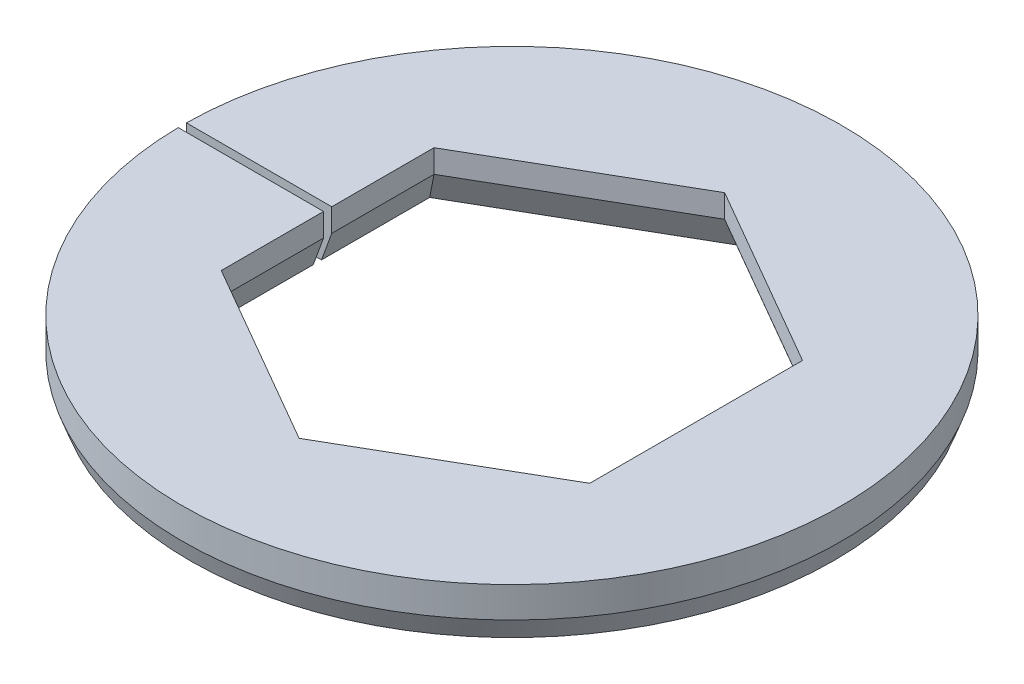
ISO-10303-21;
HEADER;
FILE_DESCRIPTION(('STEP AP214'),'2;1');
FILE_NAME('part.step','',(''),(''),'','','');
FILE_SCHEMA(('AUTOMOTIVE_DESIGN { 1 0 10303 214 1 1 1 1 }'));
ENDSEC;
DATA;
#1=APPLICATION_CONTEXT('core data for automotive mechanical design processes');
#2=APPLICATION_PROTOCOL_DEFINITION('international standard','automotive_design',2000,#1);
#3=PRODUCT_CONTEXT('',#1,'mechanical');
#4=PRODUCT('Part','Part','',(#3));
#5=PRODUCT_RELATED_PRODUCT_CATEGORY('part','',(#4));
#6=PRODUCT_DEFINITION_FORMATION('','',#4);
#7=PRODUCT_DEFINITION_CONTEXT('part definition',#1,'design');
#8=PRODUCT_DEFINITION('design','',#6,#7);
#9=PRODUCT_DEFINITION_SHAPE('','',#8);
#10=(LENGTH_UNIT() NAMED_UNIT(*) SI_UNIT(.MILLI.,.METRE.));
#11=(NAMED_UNIT(*) PLANE_ANGLE_UNIT() SI_UNIT($,.RADIAN.));
#12=(NAMED_UNIT(*) SI_UNIT($,.STERADIAN.) SOLID_ANGLE_UNIT());
#13=UNCERTAINTY_MEASURE_WITH_UNIT(LENGTH_MEASURE(1.E-05),#10,'distance_accuracy_value','');
#14=(GEOMETRIC_REPRESENTATION_CONTEXT(3) GLOBAL_UNCERTAINTY_ASSIGNED_CONTEXT((#13)) GLOBAL_UNIT_ASSIGNED_CONTEXT((#10,
#11,#12)) REPRESENTATION_CONTEXT('',''));
#15=CARTESIAN_POINT('',(0.,0.,0.));
#16=DIRECTION('',(0.,0.,1.));
#17=DIRECTION('',(1.,0.,0.));
#18=AXIS2_PLACEMENT_3D('',#15,#16,#17);
#19=CARTESIAN_POINT('',(-9.,0.,-5.19615242270663));
#20=DIRECTION('',(-1.,0.,0.));
#21=DIRECTION('',(0.,0.,1.));
#22=AXIS2_PLACEMENT_3D('',#19,#20,#21);
#23=PLANE('',#22);
#24=DIRECTION('',(0.,1.,0.));
#25=VECTOR('',#24,1.);
#26=CARTESIAN_POINT('',(-9.,0.,5.19615242270663));
#27=LINE('',#26,#25);
#28=CARTESIAN_POINT('',(-9.,1.3737387097273,5.19615242270663));
#29=VERTEX_POINT('',#28);
#30=CARTESIAN_POINT('',(-9.,2.5,5.19615242270663));
#31=VERTEX_POINT('',#30);
#32=EDGE_CURVE('E197',#29,#31,#27,.T.);
#33=ORIENTED_EDGE('',*,*,#32,.F.);
#34=DIRECTION('',(0.,0.,-1.));
#35=VECTOR('',#34,1.);
#36=CARTESIAN_POINT('',(-9.,1.3737387097273,-5.19615242270663));
#37=LINE('',#36,#35);
#38=CARTESIAN_POINT('',(-9.,1.3737387097273,0.2));
#39=VERTEX_POINT('',#38);
#40=EDGE_CURVE('E288',#29,#39,#37,.T.);
#41=ORIENTED_EDGE('',*,*,#40,.T.);
#42=DIRECTION('',(0.,1.,0.));
#43=VECTOR('',#42,1.);
#44=CARTESIAN_POINT('',(-9.,0.,0.2));
#45=LINE('',#44,#43);
#46=CARTESIAN_POINT('',(-9.,2.5,0.200000000000001));
#47=VERTEX_POINT('',#46);
#48=EDGE_CURVE('E157',#39,#47,#45,.T.);
#49=ORIENTED_EDGE('',*,*,#48,.T.);
#50=DIRECTION('',(0.,0.,1.));
#51=VECTOR('',#50,1.);
#52=CARTESIAN_POINT('',(-9.,2.5,-5.19615242270663));
#53=LINE('',#52,#51);
#54=EDGE_CURVE('E175',#47,#31,#53,.T.);
#55=ORIENTED_EDGE('',*,*,#54,.T.);
#56=EDGE_LOOP('',(#33,#41,#49,#55));
#57=FACE_BOUND('',#56,.T.);
#58=ADVANCED_FACE('F36',(#57),#23,.F.);
#59=CARTESIAN_POINT('',(0.,2.5,0.));
#60=DIRECTION('',(0.,-1.,0.));
#61=DIRECTION('',(0.,0.,-1.));
#62=AXIS2_PLACEMENT_3D('',#59,#60,#61);
#63=CYLINDRICAL_SURFACE('',#62,16.1);
#64=DIRECTION('',(0.,-1.,0.));
#65=VECTOR('',#64,1.);
#66=CARTESIAN_POINT('',(-16.0987577160475,2.5,0.199999999999999));
#67=LINE('',#66,#65);
#68=CARTESIAN_POINT('',(-16.0987577160475,2.5,0.199999999999999));
#69=VERTEX_POINT('',#68);
#70=CARTESIAN_POINT('',(-16.0987577160475,1.00000000000004,0.199999999999999));
#71=VERTEX_POINT('',#70);
#72=EDGE_CURVE('E260',#69,#71,#67,.T.);
#73=ORIENTED_EDGE('',*,*,#72,.T.);
#74=CARTESIAN_POINT('',(0.,1.00000000000004,0.));
#75=DIRECTION('',(0.,1.,0.));
#76=DIRECTION('',(0.,0.,1.));
#77=AXIS2_PLACEMENT_3D('',#74,#75,#76);
#78=CIRCLE('',#77,16.1);
#79=CARTESIAN_POINT('',(-16.0987577160475,1.00000000000004,-0.199999999999999));
#80=VERTEX_POINT('',#79);
#81=EDGE_CURVE('E202',#71,#80,#78,.T.);
#82=ORIENTED_EDGE('',*,*,#81,.T.);
#83=DIRECTION('',(0.,-1.,0.));
#84=VECTOR('',#83,1.);
#85=CARTESIAN_POINT('',(-16.0987577160475,2.5,-0.199999999999999));
#86=LINE('',#85,#84);
#87=CARTESIAN_POINT('',(-16.0987577160475,2.5,-0.199999999999999));
#88=VERTEX_POINT('',#87);
#89=EDGE_CURVE('E265',#80,#88,#86,.F.);
#90=ORIENTED_EDGE('',*,*,#89,.T.);
#91=CARTESIAN_POINT('',(0.,2.5,0.));
#92=DIRECTION('',(0.,1.,0.));
#93=DIRECTION('',(0.,0.,1.));
#94=AXIS2_PLACEMENT_3D('',#91,#92,#93);
#95=CIRCLE('',#94,16.1);
#96=EDGE_CURVE('E167',#69,#88,#95,.T.);
#97=ORIENTED_EDGE('',*,*,#96,.F.);
#98=EDGE_LOOP('',(#73,#82,#90,#97));
#99=FACE_BOUND('',#98,.T.);
#100=ADVANCED_FACE('F250',(#99),#63,.T.);
#101=CARTESIAN_POINT('',(0.,2.5,0.));
#102=DIRECTION('',(0.,1.,0.));
#103=DIRECTION('',(0.,0.,1.));
#104=AXIS2_PLACEMENT_3D('',#101,#102,#103);
#105=PLANE('',#104);
#106=DIRECTION('',(1.,0.,0.));
#107=VECTOR('',#106,1.);
#108=CARTESIAN_POINT('',(-9.,2.5,0.2));
#109=LINE('',#108,#107);
#110=EDGE_CURVE('E168',#69,#47,#109,.T.);
#111=ORIENTED_EDGE('',*,*,#110,.F.);
#112=ORIENTED_EDGE('',*,*,#96,.T.);
#113=DIRECTION('',(-1.,0.,0.));
#114=VECTOR('',#113,1.);
#115=CARTESIAN_POINT('',(-9.,2.5,-0.2));
#116=LINE('',#115,#114);
#117=CARTESIAN_POINT('',(-9.,2.5,-0.2));
#118=VERTEX_POINT('',#117);
#119=EDGE_CURVE('E150',#118,#88,#116,.T.);
#120=ORIENTED_EDGE('',*,*,#119,.F.);
#121=CARTESIAN_POINT('',(-9.,2.5,-5.19615242270663));
#122=VERTEX_POINT('',#121);
#123=EDGE_CURVE('E165',#122,#118,#53,.T.);
#124=ORIENTED_EDGE('',*,*,#123,.F.);
#125=DIRECTION('',(-0.866025403784439,0.,0.5));
#126=VECTOR('',#125,1.);
#127=CARTESIAN_POINT('',(0.,2.5,-10.3923048454133));
#128=LINE('',#127,#126);
#129=CARTESIAN_POINT('',(0.,2.5,-10.3923048454133));
#130=VERTEX_POINT('',#129);
#131=EDGE_CURVE('E181',#130,#122,#128,.T.);
#132=ORIENTED_EDGE('',*,*,#131,.F.);
#133=DIRECTION('',(-0.866025403784438,0.,-0.5));
#134=VECTOR('',#133,1.);
#135=CARTESIAN_POINT('',(9.,2.5,-5.19615242270664));
#136=LINE('',#135,#134);
#137=CARTESIAN_POINT('',(9.,2.5,-5.19615242270664));
#138=VERTEX_POINT('',#137);
#139=EDGE_CURVE('E264',#138,#130,#136,.T.);
#140=ORIENTED_EDGE('',*,*,#139,.F.);
#141=DIRECTION('',(0.,0.,-1.));
#142=VECTOR('',#141,1.);
#143=CARTESIAN_POINT('',(9.,2.5,5.19615242270664));
#144=LINE('',#143,#142);
#145=CARTESIAN_POINT('',(9.,2.5,5.19615242270664));
#146=VERTEX_POINT('',#145);
#147=EDGE_CURVE('E187',#146,#138,#144,.T.);
#148=ORIENTED_EDGE('',*,*,#147,.F.);
#149=DIRECTION('',(0.866025403784439,0.,-0.5));
#150=VECTOR('',#149,1.);
#151=CARTESIAN_POINT('',(0.,2.5,10.3923048454133));
#152=LINE('',#151,#150);
#153=CARTESIAN_POINT('',(0.,2.5,10.3923048454133));
#154=VERTEX_POINT('',#153);
#155=EDGE_CURVE('E178',#154,#146,#152,.T.);
#156=ORIENTED_EDGE('',*,*,#155,.F.);
#157=DIRECTION('',(0.866025403784439,0.,0.5));
#158=VECTOR('',#157,1.);
#159=CARTESIAN_POINT('',(-9.,2.5,5.19615242270663));
#160=LINE('',#159,#158);
#161=EDGE_CURVE('E174',#31,#154,#160,.T.);
#162=ORIENTED_EDGE('',*,*,#161,.F.);
#163=ORIENTED_EDGE('',*,*,#54,.F.);
#164=EDGE_LOOP('',(#111,#112,#120,#124,#132,#140,#148,#156,#162,#163));
#165=FACE_BOUND('',#164,.T.);
#166=ADVANCED_FACE('F163',(#165),#105,.T.);
#167=CARTESIAN_POINT('',(0.,0.,0.));
#168=DIRECTION('',(0.,1.,0.));
#169=DIRECTION('',(0.,0.,1.));
#170=AXIS2_PLACEMENT_3D('',#167,#168,#169);
#171=PLANE('',#170);
#172=DIRECTION('',(1.,0.,0.));
#173=VECTOR('',#172,1.);
#174=CARTESIAN_POINT('',(-9.,0.,0.2));
#175=LINE('',#174,#173);
#176=CARTESIAN_POINT('',(-15.7347587457851,0.,0.199999999999999));
#177=VERTEX_POINT('',#176);
#178=CARTESIAN_POINT('',(-9.5,0.,0.2));
#179=VERTEX_POINT('',#178);
#180=EDGE_CURVE('E158',#177,#179,#175,.T.);
#181=ORIENTED_EDGE('',*,*,#180,.T.);
#182=DIRECTION('',(0.,0.,1.));
#183=VECTOR('',#182,1.);
#184=CARTESIAN_POINT('',(-9.5,0.,0.));
#185=LINE('',#184,#183);
#186=CARTESIAN_POINT('',(-9.5,0.,5.48482755730144));
#187=VERTEX_POINT('',#186);
#188=EDGE_CURVE('E297',#179,#187,#185,.T.);
#189=ORIENTED_EDGE('',*,*,#188,.T.);
#190=DIRECTION('',(0.866025403784439,0.,0.5));
#191=VECTOR('',#190,1.);
#192=CARTESIAN_POINT('',(-4.75,0.,8.22724133595217));
#193=LINE('',#192,#191);
#194=CARTESIAN_POINT('',(0.,0.,10.9696551146029));
#195=VERTEX_POINT('',#194);
#196=EDGE_CURVE('E350',#187,#195,#193,.T.);
#197=ORIENTED_EDGE('',*,*,#196,.T.);
#198=DIRECTION('',(0.866025403784439,0.,-0.5));
#199=VECTOR('',#198,1.);
#200=CARTESIAN_POINT('',(4.75,0.,8.22724133595217));
#201=LINE('',#200,#199);
#202=CARTESIAN_POINT('',(9.49999999999999,0.,5.48482755730145));
#203=VERTEX_POINT('',#202);
#204=EDGE_CURVE('E348',#195,#203,#201,.T.);
#205=ORIENTED_EDGE('',*,*,#204,.T.);
#206=DIRECTION('',(0.,0.,-1.));
#207=VECTOR('',#206,1.);
#208=CARTESIAN_POINT('',(9.49999999999999,0.,0.));
#209=LINE('',#208,#207);
#210=CARTESIAN_POINT('',(9.49999999999999,0.,-5.48482755730145));
#211=VERTEX_POINT('',#210);
#212=EDGE_CURVE('E344',#203,#211,#209,.T.);
#213=ORIENTED_EDGE('',*,*,#212,.T.);
#214=DIRECTION('',(-0.866025403784439,0.,-0.5));
#215=VECTOR('',#214,1.);
#216=CARTESIAN_POINT('',(4.75,0.,-8.22724133595217));
#217=LINE('',#216,#215);
#218=CARTESIAN_POINT('',(0.,0.,-10.9696551146029));
#219=VERTEX_POINT('',#218);
#220=EDGE_CURVE('E343',#211,#219,#217,.T.);
#221=ORIENTED_EDGE('',*,*,#220,.T.);
#222=DIRECTION('',(-0.866025403784439,0.,0.5));
#223=VECTOR('',#222,1.);
#224=CARTESIAN_POINT('',(-4.75,0.,-8.22724133595217));
#225=LINE('',#224,#223);
#226=CARTESIAN_POINT('',(-9.5,0.,-5.48482755730145));
#227=VERTEX_POINT('',#226);
#228=EDGE_CURVE('E307',#219,#227,#225,.T.);
#229=ORIENTED_EDGE('',*,*,#228,.T.);
#230=DIRECTION('',(0.,0.,1.));
#231=VECTOR('',#230,1.);
#232=CARTESIAN_POINT('',(-9.5,0.,0.));
#233=LINE('',#232,#231);
#234=CARTESIAN_POINT('',(-9.5,0.,-0.2));
#235=VERTEX_POINT('',#234);
#236=EDGE_CURVE('E304',#227,#235,#233,.T.);
#237=ORIENTED_EDGE('',*,*,#236,.T.);
#238=DIRECTION('',(-1.,0.,0.));
#239=VECTOR('',#238,1.);
#240=CARTESIAN_POINT('',(-9.,0.,-0.2));
#241=LINE('',#240,#239);
#242=CARTESIAN_POINT('',(-15.7347587457851,0.,-0.199999999999999));
#243=VERTEX_POINT('',#242);
#244=EDGE_CURVE('E271',#235,#243,#241,.T.);
#245=ORIENTED_EDGE('',*,*,#244,.T.);
#246=CARTESIAN_POINT('',(0.,0.,0.));
#247=DIRECTION('',(0.,1.,0.));
#248=DIRECTION('',(0.,0.,1.));
#249=AXIS2_PLACEMENT_3D('',#246,#247,#248);
#250=CIRCLE('',#249,15.7360297657338);
#251=EDGE_CURVE('E214',#243,#177,#250,.F.);
#252=ORIENTED_EDGE('',*,*,#251,.T.);
#253=EDGE_LOOP('',(#181,#189,#197,#205,#213,#221,#229,#237,#245,#252));
#254=FACE_BOUND('',#253,.T.);
#255=ADVANCED_FACE('F246',(#254),#171,.F.);
#256=CARTESIAN_POINT('',(9.,0.,-5.19615242270664));
#257=DIRECTION('',(0.5,0.,-0.866025403784439));
#258=DIRECTION('',(-0.866025403784439,0.,-0.5));
#259=AXIS2_PLACEMENT_3D('',#256,#257,#258);
#260=PLANE('',#259);
#261=DIRECTION('',(0.,1.,0.));
#262=VECTOR('',#261,1.);
#263=CARTESIAN_POINT('',(0.,0.,-10.3923048454133));
#264=LINE('',#263,#262);
#265=CARTESIAN_POINT('',(0.,1.3737387097273,-10.3923048454133));
#266=VERTEX_POINT('',#265);
#267=EDGE_CURVE('E190',#266,#130,#264,.T.);
#268=ORIENTED_EDGE('',*,*,#267,.F.);
#269=DIRECTION('',(0.866025403784439,0.,0.5));
#270=VECTOR('',#269,1.);
#271=CARTESIAN_POINT('',(9.,1.3737387097273,-5.19615242270664));
#272=LINE('',#271,#270);
#273=CARTESIAN_POINT('',(9.,1.3737387097273,-5.19615242270664));
#274=VERTEX_POINT('',#273);
#275=EDGE_CURVE('E317',#266,#274,#272,.T.);
#276=ORIENTED_EDGE('',*,*,#275,.T.);
#277=DIRECTION('',(0.,1.,0.));
#278=VECTOR('',#277,1.);
#279=CARTESIAN_POINT('',(9.,0.,-5.19615242270664));
#280=LINE('',#279,#278);
#281=EDGE_CURVE('E191',#274,#138,#280,.T.);
#282=ORIENTED_EDGE('',*,*,#281,.T.);
#283=ORIENTED_EDGE('',*,*,#139,.T.);
#284=EDGE_LOOP('',(#268,#276,#282,#283));
#285=FACE_BOUND('',#284,.T.);
#286=ADVANCED_FACE('F232',(#285),#260,.F.);
#287=CARTESIAN_POINT('',(9.,0.,5.19615242270664));
#288=DIRECTION('',(1.,0.,0.));
#289=DIRECTION('',(0.,0.,-1.));
#290=AXIS2_PLACEMENT_3D('',#287,#288,#289);
#291=PLANE('',#290);
#292=ORIENTED_EDGE('',*,*,#281,.F.);
#293=DIRECTION('',(0.,0.,1.));
#294=VECTOR('',#293,1.);
#295=CARTESIAN_POINT('',(9.,1.3737387097273,5.19615242270664));
#296=LINE('',#295,#294);
#297=CARTESIAN_POINT('',(9.,1.3737387097273,5.19615242270664));
#298=VERTEX_POINT('',#297);
#299=EDGE_CURVE('E61',#274,#298,#296,.T.);
#300=ORIENTED_EDGE('',*,*,#299,.T.);
#301=DIRECTION('',(0.,1.,0.));
#302=VECTOR('',#301,1.);
#303=CARTESIAN_POINT('',(9.,0.,5.19615242270664));
#304=LINE('',#303,#302);
#305=EDGE_CURVE('E193',#298,#146,#304,.T.);
#306=ORIENTED_EDGE('',*,*,#305,.T.);
#307=ORIENTED_EDGE('',*,*,#147,.T.);
#308=EDGE_LOOP('',(#292,#300,#306,#307));
#309=FACE_BOUND('',#308,.T.);
#310=ADVANCED_FACE('F228',(#309),#291,.F.);
#311=CARTESIAN_POINT('',(0.,0.,10.3923048454133));
#312=DIRECTION('',(0.5,0.,0.866025403784439));
#313=DIRECTION('',(0.866025403784439,0.,-0.5));
#314=AXIS2_PLACEMENT_3D('',#311,#312,#313);
#315=PLANE('',#314);
#316=ORIENTED_EDGE('',*,*,#305,.F.);
#317=DIRECTION('',(-0.866025403784439,0.,0.5));
#318=VECTOR('',#317,1.);
#319=CARTESIAN_POINT('',(0.,1.3737387097273,10.3923048454133));
#320=LINE('',#319,#318);
#321=CARTESIAN_POINT('',(0.,1.3737387097273,10.3923048454133));
#322=VERTEX_POINT('',#321);
#323=EDGE_CURVE('E46',#298,#322,#320,.T.);
#324=ORIENTED_EDGE('',*,*,#323,.T.);
#325=DIRECTION('',(0.,1.,0.));
#326=VECTOR('',#325,1.);
#327=CARTESIAN_POINT('',(0.,0.,10.3923048454133));
#328=LINE('',#327,#326);
#329=EDGE_CURVE('E195',#322,#154,#328,.T.);
#330=ORIENTED_EDGE('',*,*,#329,.T.);
#331=ORIENTED_EDGE('',*,*,#155,.T.);
#332=EDGE_LOOP('',(#316,#324,#330,#331));
#333=FACE_BOUND('',#332,.T.);
#334=ADVANCED_FACE('F231',(#333),#315,.F.);
#335=CARTESIAN_POINT('',(-9.,0.,5.19615242270663));
#336=DIRECTION('',(-0.5,0.,0.866025403784439));
#337=DIRECTION('',(0.866025403784439,0.,0.5));
#338=AXIS2_PLACEMENT_3D('',#335,#336,#337);
#339=PLANE('',#338);
#340=ORIENTED_EDGE('',*,*,#329,.F.);
#341=DIRECTION('',(-0.866025403784439,0.,-0.5));
#342=VECTOR('',#341,1.);
#343=CARTESIAN_POINT('',(-9.,1.3737387097273,5.19615242270663));
#344=LINE('',#343,#342);
#345=EDGE_CURVE('E11',#322,#29,#344,.T.);
#346=ORIENTED_EDGE('',*,*,#345,.T.);
#347=ORIENTED_EDGE('',*,*,#32,.T.);
#348=ORIENTED_EDGE('',*,*,#161,.T.);
#349=EDGE_LOOP('',(#340,#346,#347,#348));
#350=FACE_BOUND('',#349,.T.);
#351=ADVANCED_FACE('F235',(#350),#339,.F.);
#352=DIRECTION('',(0.,1.,0.));
#353=VECTOR('',#352,1.);
#354=CARTESIAN_POINT('',(-9.,0.,-0.2));
#355=LINE('',#354,#353);
#356=CARTESIAN_POINT('',(-9.,1.3737387097273,-0.2));
#357=VERTEX_POINT('',#356);
#358=EDGE_CURVE('E145',#357,#118,#355,.T.);
#359=ORIENTED_EDGE('',*,*,#358,.F.);
#360=DIRECTION('',(0.,0.,-1.));
#361=VECTOR('',#360,1.);
#362=CARTESIAN_POINT('',(-9.,1.3737387097273,-5.19615242270663));
#363=LINE('',#362,#361);
#364=CARTESIAN_POINT('',(-9.,1.3737387097273,-5.19615242270663));
#365=VERTEX_POINT('',#364);
#366=EDGE_CURVE('E313',#357,#365,#363,.T.);
#367=ORIENTED_EDGE('',*,*,#366,.T.);
#368=DIRECTION('',(0.,1.,0.));
#369=VECTOR('',#368,1.);
#370=CARTESIAN_POINT('',(-9.,0.,-5.19615242270663));
#371=LINE('',#370,#369);
#372=EDGE_CURVE('E172',#365,#122,#371,.T.);
#373=ORIENTED_EDGE('',*,*,#372,.T.);
#374=ORIENTED_EDGE('',*,*,#123,.T.);
#375=EDGE_LOOP('',(#359,#367,#373,#374));
#376=FACE_BOUND('',#375,.T.);
#377=ADVANCED_FACE('F170',(#376),#23,.F.);
#378=CARTESIAN_POINT('',(0.,0.,-10.3923048454133));
#379=DIRECTION('',(-0.5,0.,-0.866025403784439));
#380=DIRECTION('',(-0.866025403784439,0.,0.5));
#381=AXIS2_PLACEMENT_3D('',#378,#379,#380);
#382=PLANE('',#381);
#383=ORIENTED_EDGE('',*,*,#372,.F.);
#384=DIRECTION('',(0.866025403784439,0.,-0.5));
#385=VECTOR('',#384,1.);
#386=CARTESIAN_POINT('',(0.,1.3737387097273,-10.3923048454133));
#387=LINE('',#386,#385);
#388=EDGE_CURVE('E315',#365,#266,#387,.T.);
#389=ORIENTED_EDGE('',*,*,#388,.T.);
#390=ORIENTED_EDGE('',*,*,#267,.T.);
#391=ORIENTED_EDGE('',*,*,#131,.T.);
#392=EDGE_LOOP('',(#383,#389,#390,#391));
#393=FACE_BOUND('',#392,.T.);
#394=ADVANCED_FACE('F226',(#393),#382,.F.);
#395=CARTESIAN_POINT('',(-9.,0.,-0.2));
#396=DIRECTION('',(0.,0.,-1.));
#397=DIRECTION('',(-1.,0.,0.));
#398=AXIS2_PLACEMENT_3D('',#395,#396,#397);
#399=PLANE('',#398);
#400=ORIENTED_EDGE('',*,*,#244,.F.);
#401=DIRECTION('',(-0.34202014332567,-0.939692620785908,0.));
#402=VECTOR('',#401,1.);
#403=CARTESIAN_POINT('',(-9.5,0.,-0.2));
#404=LINE('',#403,#402);
#405=EDGE_CURVE('E153',#235,#357,#404,.F.);
#406=ORIENTED_EDGE('',*,*,#405,.T.);
#407=ORIENTED_EDGE('',*,*,#358,.T.);
#408=ORIENTED_EDGE('',*,*,#119,.T.);
#409=ORIENTED_EDGE('',*,*,#89,.F.);
#410=CARTESIAN_POINT('',(-16.0987577160475,1.00000000000004,-0.199999999999999));
#411=CARTESIAN_POINT('',(-16.0380913177128,0.833333298131377,-0.199999999999999));
#412=CARTESIAN_POINT('',(-15.9774248710236,0.666666613863712,-0.199999999999999));
#413=CARTESIAN_POINT('',(-15.8560918809361,0.333333280530367,-0.199999999999999));
#414=CARTESIAN_POINT('',(-15.7954253375378,0.166666631464687,-0.199999999999999));
#415=CARTESIAN_POINT('',(-15.7347587457851,0.,-0.199999999999999));
#416=B_SPLINE_CURVE_WITH_KNOTS('',3,(#410,#411,#412,#413,#414,#415),.UNSPECIFIED.,.F.,.F.,(4,2,
4),(0.,0.532093800554069,1.06418760110814),.UNSPECIFIED.);
#417=EDGE_CURVE('E205',#80,#243,#416,.T.);
#418=ORIENTED_EDGE('',*,*,#417,.T.);
#419=EDGE_LOOP('',(#400,#406,#407,#408,#409,#418));
#420=FACE_BOUND('',#419,.T.);
#421=ADVANCED_FACE('F148',(#420),#399,.F.);
#422=CARTESIAN_POINT('',(-9.,0.,0.2));
#423=DIRECTION('',(0.,0.,1.));
#424=DIRECTION('',(1.,0.,0.));
#425=AXIS2_PLACEMENT_3D('',#422,#423,#424);
#426=PLANE('',#425);
#427=ORIENTED_EDGE('',*,*,#48,.F.);
#428=DIRECTION('',(0.34202014332567,0.939692620785908,0.));
#429=VECTOR('',#428,1.);
#430=CARTESIAN_POINT('',(-9.5,0.,0.2));
#431=LINE('',#430,#429);
#432=EDGE_CURVE('E300',#39,#179,#431,.F.);
#433=ORIENTED_EDGE('',*,*,#432,.T.);
#434=ORIENTED_EDGE('',*,*,#180,.F.);
#435=CARTESIAN_POINT('',(-15.7347587457851,0.,0.199999999999999));
#436=CARTESIAN_POINT('',(-15.7954253375378,0.166666631464687,0.199999999999999));
#437=CARTESIAN_POINT('',(-15.8560918809361,0.333333280530367,0.199999999999999));
#438=CARTESIAN_POINT('',(-15.9774248710236,0.666666613863712,0.199999999999999));
#439=CARTESIAN_POINT('',(-16.0380913177128,0.833333298131377,0.199999999999999));
#440=CARTESIAN_POINT('',(-16.0987577160475,1.00000000000004,0.199999999999999));
#441=B_SPLINE_CURVE_WITH_KNOTS('',3,(#435,#436,#437,#438,#439,#440),.UNSPECIFIED.,.F.,.F.,(4,2,
4),(0.,0.532093800554071,1.06418760110814),.UNSPECIFIED.);
#442=EDGE_CURVE('E270',#177,#71,#441,.T.);
#443=ORIENTED_EDGE('',*,*,#442,.T.);
#444=ORIENTED_EDGE('',*,*,#72,.F.);
#445=ORIENTED_EDGE('',*,*,#110,.T.);
#446=EDGE_LOOP('',(#427,#433,#434,#443,#444,#445));
#447=FACE_BOUND('',#446,.T.);
#448=ADVANCED_FACE('F225',(#447),#426,.F.);
#449=CARTESIAN_POINT('',(0.,1.00000000000004,0.));
#450=DIRECTION('',(0.,1.,0.));
#451=DIRECTION('',(0.,0.,1.));
#452=AXIS2_PLACEMENT_3D('',#449,#450,#451);
#453=CONICAL_SURFACE('',#452,16.1,0.349065850398863);
#454=ORIENTED_EDGE('',*,*,#442,.F.);
#455=ORIENTED_EDGE('',*,*,#251,.F.);
#456=ORIENTED_EDGE('',*,*,#417,.F.);
#457=ORIENTED_EDGE('',*,*,#81,.F.);
#458=EDGE_LOOP('',(#454,#455,#456,#457));
#459=FACE_BOUND('',#458,.T.);
#460=ADVANCED_FACE('F217',(#459),#453,.T.);
#461=CARTESIAN_POINT('',(-9.5,0.,0.));
#462=DIRECTION('',(-0.939692620785908,0.34202014332567,0.));
#463=DIRECTION('',(0.,0.,1.));
#464=AXIS2_PLACEMENT_3D('',#461,#462,#463);
#465=PLANE('',#464);
#466=ORIENTED_EDGE('',*,*,#405,.F.);
#467=ORIENTED_EDGE('',*,*,#236,.F.);
#468=DIRECTION('',(-0.335540895264848,-0.921891033043757,-0.193724626205287));
#469=VECTOR('',#468,1.);
#470=CARTESIAN_POINT('',(-9.1434723074154,0.979551784786433,-5.27898619801417));
#471=LINE('',#470,#469);
#472=EDGE_CURVE('E41',#365,#227,#471,.T.);
#473=ORIENTED_EDGE('',*,*,#472,.F.);
#474=ORIENTED_EDGE('',*,*,#366,.F.);
#475=EDGE_LOOP('',(#466,#467,#473,#474));
#476=FACE_BOUND('',#475,.T.);
#477=ADVANCED_FACE('F39',(#476),#465,.F.);
#478=CARTESIAN_POINT('',(-4.75,0.,-8.22724133595217));
#479=DIRECTION('',(-0.469846310392954,0.342020143325669,-0.813797681349374));
#480=DIRECTION('',(-0.866025403784439,0.,0.5));
#481=AXIS2_PLACEMENT_3D('',#478,#479,#480);
#482=PLANE('',#481);
#483=ORIENTED_EDGE('',*,*,#472,.T.);
#484=ORIENTED_EDGE('',*,*,#228,.F.);
#485=DIRECTION('',(0.,-0.921891033043757,-0.387449252410575));
#486=VECTOR('',#485,1.);
#487=CARTESIAN_POINT('',(0.,0.979551784786433,-10.5579723960283));
#488=LINE('',#487,#486);
#489=EDGE_CURVE('E330',#266,#219,#488,.T.);
#490=ORIENTED_EDGE('',*,*,#489,.F.);
#491=ORIENTED_EDGE('',*,*,#388,.F.);
#492=EDGE_LOOP('',(#483,#484,#490,#491));
#493=FACE_BOUND('',#492,.T.);
#494=ADVANCED_FACE('F340',(#493),#482,.F.);
#495=CARTESIAN_POINT('',(4.75,0.,-8.22724133595217));
#496=DIRECTION('',(0.469846310392954,0.342020143325668,-0.813797681349374));
#497=DIRECTION('',(-0.866025403784439,0.,-0.5));
#498=AXIS2_PLACEMENT_3D('',#495,#496,#497);
#499=PLANE('',#498);
#500=ORIENTED_EDGE('',*,*,#489,.T.);
#501=ORIENTED_EDGE('',*,*,#220,.F.);
#502=DIRECTION('',(0.335540895264849,-0.921891033043757,-0.193724626205287));
#503=VECTOR('',#502,1.);
#504=CARTESIAN_POINT('',(9.1434723074154,0.97955178478644,-5.27898619801417));
#505=LINE('',#504,#503);
#506=EDGE_CURVE('E328',#274,#211,#505,.T.);
#507=ORIENTED_EDGE('',*,*,#506,.F.);
#508=ORIENTED_EDGE('',*,*,#275,.F.);
#509=EDGE_LOOP('',(#500,#501,#507,#508));
#510=FACE_BOUND('',#509,.T.);
#511=ADVANCED_FACE('F384',(#510),#499,.F.);
#512=CARTESIAN_POINT('',(9.49999999999999,0.,0.));
#513=DIRECTION('',(0.939692620785908,0.34202014332567,0.));
#514=DIRECTION('',(0.,0.,-1.));
#515=AXIS2_PLACEMENT_3D('',#512,#513,#514);
#516=PLANE('',#515);
#517=ORIENTED_EDGE('',*,*,#506,.T.);
#518=ORIENTED_EDGE('',*,*,#212,.F.);
#519=DIRECTION('',(0.335540895264849,-0.921891033043757,0.193724626205287));
#520=VECTOR('',#519,1.);
#521=CARTESIAN_POINT('',(9.1434723074154,0.979551784786432,5.27898619801418));
#522=LINE('',#521,#520);
#523=EDGE_CURVE('E325',#298,#203,#522,.T.);
#524=ORIENTED_EDGE('',*,*,#523,.F.);
#525=ORIENTED_EDGE('',*,*,#299,.F.);
#526=EDGE_LOOP('',(#517,#518,#524,#525));
#527=FACE_BOUND('',#526,.T.);
#528=ADVANCED_FACE('F368',(#527),#516,.F.);
#529=CARTESIAN_POINT('',(4.75,0.,8.22724133595217));
#530=DIRECTION('',(0.469846310392954,0.342020143325669,0.813797681349374));
#531=DIRECTION('',(0.866025403784439,0.,-0.5));
#532=AXIS2_PLACEMENT_3D('',#529,#530,#531);
#533=PLANE('',#532);
#534=ORIENTED_EDGE('',*,*,#523,.T.);
#535=ORIENTED_EDGE('',*,*,#204,.F.);
#536=DIRECTION('',(0.,-0.921891033043757,0.387449252410576));
#537=VECTOR('',#536,1.);
#538=CARTESIAN_POINT('',(0.,0.97955178478644,10.5579723960283));
#539=LINE('',#538,#537);
#540=EDGE_CURVE('E322',#322,#195,#539,.T.);
#541=ORIENTED_EDGE('',*,*,#540,.F.);
#542=ORIENTED_EDGE('',*,*,#323,.F.);
#543=EDGE_LOOP('',(#534,#535,#541,#542));
#544=FACE_BOUND('',#543,.T.);
#545=ADVANCED_FACE('F359',(#544),#533,.F.);
#546=CARTESIAN_POINT('',(-4.75,0.,8.22724133595217));
#547=DIRECTION('',(-0.469846310392954,0.342020143325669,0.813797681349373));
#548=DIRECTION('',(0.866025403784439,0.,0.5));
#549=AXIS2_PLACEMENT_3D('',#546,#547,#548);
#550=PLANE('',#549);
#551=ORIENTED_EDGE('',*,*,#540,.T.);
#552=ORIENTED_EDGE('',*,*,#196,.F.);
#553=DIRECTION('',(0.335540895264848,0.921891033043757,-0.193724626205288));
#554=VECTOR('',#553,1.);
#555=CARTESIAN_POINT('',(-9.1434723074154,0.979551784786436,5.27898619801417));
#556=LINE('',#555,#554);
#557=EDGE_CURVE('E302',#29,#187,#556,.F.);
#558=ORIENTED_EDGE('',*,*,#557,.F.);
#559=ORIENTED_EDGE('',*,*,#345,.F.);
#560=EDGE_LOOP('',(#551,#552,#558,#559));
#561=FACE_BOUND('',#560,.T.);
#562=ADVANCED_FACE('F361',(#561),#550,.F.);
#563=CARTESIAN_POINT('',(-9.5,0.,0.));
#564=DIRECTION('',(-0.939692620785908,0.34202014332567,0.));
#565=DIRECTION('',(0.,0.,1.));
#566=AXIS2_PLACEMENT_3D('',#563,#564,#565);
#567=PLANE('',#566);
#568=ORIENTED_EDGE('',*,*,#432,.F.);
#569=ORIENTED_EDGE('',*,*,#40,.F.);
#570=ORIENTED_EDGE('',*,*,#557,.T.);
#571=ORIENTED_EDGE('',*,*,#188,.F.);
#572=EDGE_LOOP('',(#568,#569,#570,#571));
#573=FACE_BOUND('',#572,.T.);
#574=ADVANCED_FACE('F299',(#573),#567,.F.);
#575=CLOSED_SHELL('',(#58,#100,#166,#255,#286,#310,#334,#351,#377,#394,#421,#448,#460,#477,#494,
#511,#528,#545,#562,#574));
#576=MANIFOLD_SOLID_BREP('B2',#575);
#577=ADVANCED_BREP_SHAPE_REPRESENTATION('',(#18,#576),#14);
#578=SHAPE_DEFINITION_REPRESENTATION(#9,#577);
ENDSEC;
END-ISO-10303-21;
